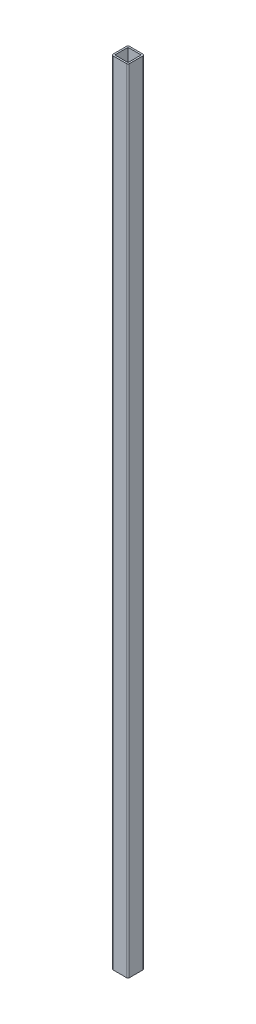
ISO-10303-21;
HEADER;
FILE_DESCRIPTION(('STEP AP214'),'2;1');
FILE_NAME('part.step','',(''),(''),'','','');
FILE_SCHEMA(('AUTOMOTIVE_DESIGN { 1 0 10303 214 1 1 1 1 }'));
ENDSEC;
DATA;
#1=APPLICATION_CONTEXT('core data for automotive mechanical design processes');
#2=APPLICATION_PROTOCOL_DEFINITION('international standard','automotive_design',2000,#1);
#3=PRODUCT_CONTEXT('',#1,'mechanical');
#4=PRODUCT('Part','Part','',(#3));
#5=PRODUCT_RELATED_PRODUCT_CATEGORY('part','',(#4));
#6=PRODUCT_DEFINITION_FORMATION('','',#4);
#7=PRODUCT_DEFINITION_CONTEXT('part definition',#1,'design');
#8=PRODUCT_DEFINITION('design','',#6,#7);
#9=PRODUCT_DEFINITION_SHAPE('','',#8);
#10=(LENGTH_UNIT() NAMED_UNIT(*) SI_UNIT(.MILLI.,.METRE.));
#11=(NAMED_UNIT(*) PLANE_ANGLE_UNIT() SI_UNIT($,.RADIAN.));
#12=(NAMED_UNIT(*) SI_UNIT($,.STERADIAN.) SOLID_ANGLE_UNIT());
#13=UNCERTAINTY_MEASURE_WITH_UNIT(LENGTH_MEASURE(1.E-05),#10,'distance_accuracy_value','');
#14=(GEOMETRIC_REPRESENTATION_CONTEXT(3) GLOBAL_UNCERTAINTY_ASSIGNED_CONTEXT((#13)) GLOBAL_UNIT_ASSIGNED_CONTEXT((#10,
#11,#12)) REPRESENTATION_CONTEXT('',''));
#15=CARTESIAN_POINT('',(0.,0.,0.));
#16=DIRECTION('',(0.,0.,1.));
#17=DIRECTION('',(1.,0.,0.));
#18=AXIS2_PLACEMENT_3D('',#15,#16,#17);
#19=CARTESIAN_POINT('',(12.7,1219.2,-12.7));
#20=DIRECTION('',(0.,0.,1.));
#21=DIRECTION('',(1.,0.,0.));
#22=AXIS2_PLACEMENT_3D('',#19,#20,#21);
#23=PLANE('',#22);
#24=DIRECTION('',(-1.,0.,0.));
#25=VECTOR('',#24,1.);
#26=CARTESIAN_POINT('',(12.7,1219.2,-12.7));
#27=LINE('',#26,#25);
#28=CARTESIAN_POINT('',(10.16,1219.2,-12.7));
#29=VERTEX_POINT('',#28);
#30=CARTESIAN_POINT('',(-10.16,1219.2,-12.7));
#31=VERTEX_POINT('',#30);
#32=EDGE_CURVE('E179',#29,#31,#27,.T.);
#33=ORIENTED_EDGE('',*,*,#32,.F.);
#34=DIRECTION('',(0.,-1.,0.));
#35=VECTOR('',#34,1.);
#36=CARTESIAN_POINT('',(10.16,0.,-12.7));
#37=LINE('',#36,#35);
#38=CARTESIAN_POINT('',(10.16,0.,-12.7));
#39=VERTEX_POINT('',#38);
#40=EDGE_CURVE('E11',#29,#39,#37,.T.);
#41=ORIENTED_EDGE('',*,*,#40,.T.);
#42=DIRECTION('',(-1.,0.,0.));
#43=VECTOR('',#42,1.);
#44=CARTESIAN_POINT('',(12.7,0.,-12.7));
#45=LINE('',#44,#43);
#46=CARTESIAN_POINT('',(-10.16,0.,-12.7));
#47=VERTEX_POINT('',#46);
#48=EDGE_CURVE('E196',#39,#47,#45,.T.);
#49=ORIENTED_EDGE('',*,*,#48,.T.);
#50=DIRECTION('',(0.,-1.,0.));
#51=VECTOR('',#50,1.);
#52=CARTESIAN_POINT('',(-10.16,1219.2,-12.7));
#53=LINE('',#52,#51);
#54=EDGE_CURVE('E48',#47,#31,#53,.F.);
#55=ORIENTED_EDGE('',*,*,#54,.T.);
#56=EDGE_LOOP('',(#33,#41,#49,#55));
#57=FACE_BOUND('',#56,.T.);
#58=ADVANCED_FACE('F39',(#57),#23,.F.);
#59=CARTESIAN_POINT('',(-12.7,1219.2,-12.7));
#60=DIRECTION('',(1.,0.,0.));
#61=DIRECTION('',(0.,0.,-1.));
#62=AXIS2_PLACEMENT_3D('',#59,#60,#61);
#63=PLANE('',#62);
#64=DIRECTION('',(0.,0.,1.));
#65=VECTOR('',#64,1.);
#66=CARTESIAN_POINT('',(-12.7,0.,-12.7));
#67=LINE('',#66,#65);
#68=CARTESIAN_POINT('',(-12.7,0.,-10.16));
#69=VERTEX_POINT('',#68);
#70=CARTESIAN_POINT('',(-12.7,0.,10.16));
#71=VERTEX_POINT('',#70);
#72=EDGE_CURVE('E200',#69,#71,#67,.T.);
#73=ORIENTED_EDGE('',*,*,#72,.T.);
#74=DIRECTION('',(0.,-1.,0.));
#75=VECTOR('',#74,1.);
#76=CARTESIAN_POINT('',(-12.7,1219.2,10.16));
#77=LINE('',#76,#75);
#78=CARTESIAN_POINT('',(-12.7,1219.2,10.16));
#79=VERTEX_POINT('',#78);
#80=EDGE_CURVE('E233',#71,#79,#77,.F.);
#81=ORIENTED_EDGE('',*,*,#80,.T.);
#82=DIRECTION('',(0.,0.,1.));
#83=VECTOR('',#82,1.);
#84=CARTESIAN_POINT('',(-12.7,1219.2,-12.7));
#85=LINE('',#84,#83);
#86=CARTESIAN_POINT('',(-12.7,1219.2,-10.16));
#87=VERTEX_POINT('',#86);
#88=EDGE_CURVE('E183',#87,#79,#85,.T.);
#89=ORIENTED_EDGE('',*,*,#88,.F.);
#90=DIRECTION('',(0.,-1.,0.));
#91=VECTOR('',#90,1.);
#92=CARTESIAN_POINT('',(-12.7,1219.2,-10.16));
#93=LINE('',#92,#91);
#94=EDGE_CURVE('E229',#87,#69,#93,.T.);
#95=ORIENTED_EDGE('',*,*,#94,.T.);
#96=EDGE_LOOP('',(#73,#81,#89,#95));
#97=FACE_BOUND('',#96,.T.);
#98=ADVANCED_FACE('F266',(#97),#63,.F.);
#99=CARTESIAN_POINT('',(12.7,1219.2,12.7));
#100=DIRECTION('',(0.,0.,1.));
#101=DIRECTION('',(1.,0.,0.));
#102=AXIS2_PLACEMENT_3D('',#99,#100,#101);
#103=PLANE('',#102);
#104=DIRECTION('',(-1.,0.,0.));
#105=VECTOR('',#104,1.);
#106=CARTESIAN_POINT('',(12.7,1219.2,12.7));
#107=LINE('',#106,#105);
#108=CARTESIAN_POINT('',(10.16,1219.2,12.7));
#109=VERTEX_POINT('',#108);
#110=CARTESIAN_POINT('',(-10.16,1219.2,12.7));
#111=VERTEX_POINT('',#110);
#112=EDGE_CURVE('E188',#109,#111,#107,.T.);
#113=ORIENTED_EDGE('',*,*,#112,.T.);
#114=DIRECTION('',(0.,-1.,0.));
#115=VECTOR('',#114,1.);
#116=CARTESIAN_POINT('',(-10.16,0.,12.7));
#117=LINE('',#116,#115);
#118=CARTESIAN_POINT('',(-10.16,0.,12.7));
#119=VERTEX_POINT('',#118);
#120=EDGE_CURVE('E213',#111,#119,#117,.T.);
#121=ORIENTED_EDGE('',*,*,#120,.T.);
#122=DIRECTION('',(-1.,0.,0.));
#123=VECTOR('',#122,1.);
#124=CARTESIAN_POINT('',(12.7,0.,12.7));
#125=LINE('',#124,#123);
#126=CARTESIAN_POINT('',(10.16,0.,12.7));
#127=VERTEX_POINT('',#126);
#128=EDGE_CURVE('E204',#127,#119,#125,.T.);
#129=ORIENTED_EDGE('',*,*,#128,.F.);
#130=DIRECTION('',(0.,-1.,0.));
#131=VECTOR('',#130,1.);
#132=CARTESIAN_POINT('',(10.16,1219.2,12.7));
#133=LINE('',#132,#131);
#134=EDGE_CURVE('E195',#127,#109,#133,.F.);
#135=ORIENTED_EDGE('',*,*,#134,.T.);
#136=EDGE_LOOP('',(#113,#121,#129,#135));
#137=FACE_BOUND('',#136,.T.);
#138=ADVANCED_FACE('F274',(#137),#103,.T.);
#139=CARTESIAN_POINT('',(12.7,1219.2,-12.7));
#140=DIRECTION('',(1.,0.,0.));
#141=DIRECTION('',(0.,0.,-1.));
#142=AXIS2_PLACEMENT_3D('',#139,#140,#141);
#143=PLANE('',#142);
#144=DIRECTION('',(0.,0.,1.));
#145=VECTOR('',#144,1.);
#146=CARTESIAN_POINT('',(12.7,1219.2,-12.7));
#147=LINE('',#146,#145);
#148=CARTESIAN_POINT('',(12.7,1219.2,-10.16));
#149=VERTEX_POINT('',#148);
#150=CARTESIAN_POINT('',(12.7,1219.2,10.16));
#151=VERTEX_POINT('',#150);
#152=EDGE_CURVE('E192',#149,#151,#147,.T.);
#153=ORIENTED_EDGE('',*,*,#152,.T.);
#154=DIRECTION('',(0.,-1.,0.));
#155=VECTOR('',#154,1.);
#156=CARTESIAN_POINT('',(12.7,1219.2,10.16));
#157=LINE('',#156,#155);
#158=CARTESIAN_POINT('',(12.7,0.,10.16));
#159=VERTEX_POINT('',#158);
#160=EDGE_CURVE('E249',#151,#159,#157,.T.);
#161=ORIENTED_EDGE('',*,*,#160,.T.);
#162=DIRECTION('',(0.,0.,1.));
#163=VECTOR('',#162,1.);
#164=CARTESIAN_POINT('',(12.7,0.,-12.7));
#165=LINE('',#164,#163);
#166=CARTESIAN_POINT('',(12.7,0.,-10.16));
#167=VERTEX_POINT('',#166);
#168=EDGE_CURVE('E184',#167,#159,#165,.T.);
#169=ORIENTED_EDGE('',*,*,#168,.F.);
#170=DIRECTION('',(0.,-1.,0.));
#171=VECTOR('',#170,1.);
#172=CARTESIAN_POINT('',(12.7,1219.2,-10.16));
#173=LINE('',#172,#171);
#174=EDGE_CURVE('E62',#167,#149,#173,.F.);
#175=ORIENTED_EDGE('',*,*,#174,.T.);
#176=EDGE_LOOP('',(#153,#161,#169,#175));
#177=FACE_BOUND('',#176,.T.);
#178=ADVANCED_FACE('F279',(#177),#143,.T.);
#179=CARTESIAN_POINT('',(0.,1219.2,0.));
#180=DIRECTION('',(0.,1.,0.));
#181=DIRECTION('',(0.,0.,1.));
#182=AXIS2_PLACEMENT_3D('',#179,#180,#181);
#183=PLANE('',#182);
#184=DIRECTION('',(-1.,0.,0.));
#185=VECTOR('',#184,1.);
#186=CARTESIAN_POINT('',(12.7,1219.2,-10.16));
#187=LINE('',#186,#185);
#188=CARTESIAN_POINT('',(10.16,1219.2,-10.16));
#189=VERTEX_POINT('',#188);
#190=CARTESIAN_POINT('',(-10.16,1219.2,-10.16));
#191=VERTEX_POINT('',#190);
#192=EDGE_CURVE('E160',#189,#191,#187,.T.);
#193=ORIENTED_EDGE('',*,*,#192,.F.);
#194=DIRECTION('',(0.,0.,1.));
#195=VECTOR('',#194,1.);
#196=CARTESIAN_POINT('',(10.16,1219.2,-12.7));
#197=LINE('',#196,#195);
#198=CARTESIAN_POINT('',(10.16,1219.2,10.16));
#199=VERTEX_POINT('',#198);
#200=EDGE_CURVE('E139',#189,#199,#197,.T.);
#201=ORIENTED_EDGE('',*,*,#200,.T.);
#202=DIRECTION('',(-1.,0.,0.));
#203=VECTOR('',#202,1.);
#204=CARTESIAN_POINT('',(12.7,1219.2,10.16));
#205=LINE('',#204,#203);
#206=CARTESIAN_POINT('',(-10.16,1219.2,10.16));
#207=VERTEX_POINT('',#206);
#208=EDGE_CURVE('E173',#199,#207,#205,.T.);
#209=ORIENTED_EDGE('',*,*,#208,.T.);
#210=DIRECTION('',(0.,0.,1.));
#211=VECTOR('',#210,1.);
#212=CARTESIAN_POINT('',(-10.16,1219.2,-12.7));
#213=LINE('',#212,#211);
#214=EDGE_CURVE('E164',#191,#207,#213,.T.);
#215=ORIENTED_EDGE('',*,*,#214,.F.);
#216=EDGE_LOOP('',(#193,#201,#209,#215));
#217=FACE_BOUND('',#216,.T.);
#218=ORIENTED_EDGE('',*,*,#88,.T.);
#219=CARTESIAN_POINT('',(-10.16,1219.2,10.16));
#220=DIRECTION('',(0.,1.,0.));
#221=DIRECTION('',(0.,0.,1.));
#222=AXIS2_PLACEMENT_3D('',#219,#220,#221);
#223=CIRCLE('',#222,2.54);
#224=EDGE_CURVE('E244',#79,#111,#223,.T.);
#225=ORIENTED_EDGE('',*,*,#224,.T.);
#226=ORIENTED_EDGE('',*,*,#112,.F.);
#227=CARTESIAN_POINT('',(10.16,1219.2,10.16));
#228=DIRECTION('',(0.,1.,0.));
#229=DIRECTION('',(0.,0.,1.));
#230=AXIS2_PLACEMENT_3D('',#227,#228,#229);
#231=CIRCLE('',#230,2.54);
#232=EDGE_CURVE('E55',#109,#151,#231,.T.);
#233=ORIENTED_EDGE('',*,*,#232,.T.);
#234=ORIENTED_EDGE('',*,*,#152,.F.);
#235=CARTESIAN_POINT('',(10.16,1219.2,-10.16));
#236=DIRECTION('',(0.,1.,0.));
#237=DIRECTION('',(0.,0.,1.));
#238=AXIS2_PLACEMENT_3D('',#235,#236,#237);
#239=CIRCLE('',#238,2.54);
#240=EDGE_CURVE('E239',#149,#29,#239,.T.);
#241=ORIENTED_EDGE('',*,*,#240,.T.);
#242=ORIENTED_EDGE('',*,*,#32,.T.);
#243=CARTESIAN_POINT('',(-10.16,1219.2,-10.16));
#244=DIRECTION('',(0.,1.,0.));
#245=DIRECTION('',(0.,0.,1.));
#246=AXIS2_PLACEMENT_3D('',#243,#244,#245);
#247=CIRCLE('',#246,2.54);
#248=EDGE_CURVE('E236',#31,#87,#247,.T.);
#249=ORIENTED_EDGE('',*,*,#248,.T.);
#250=EDGE_LOOP('',(#218,#225,#226,#233,#234,#241,#242,#249));
#251=FACE_BOUND('',#250,.T.);
#252=ADVANCED_FACE('F260',(#217,#251),#183,.T.);
#253=CARTESIAN_POINT('',(0.,0.,0.));
#254=DIRECTION('',(0.,1.,0.));
#255=DIRECTION('',(0.,0.,1.));
#256=AXIS2_PLACEMENT_3D('',#253,#254,#255);
#257=PLANE('',#256);
#258=DIRECTION('',(0.,0.,1.));
#259=VECTOR('',#258,1.);
#260=CARTESIAN_POINT('',(10.16,0.,-12.7));
#261=LINE('',#260,#259);
#262=CARTESIAN_POINT('',(10.16,0.,-10.16));
#263=VERTEX_POINT('',#262);
#264=CARTESIAN_POINT('',(10.16,0.,10.16));
#265=VERTEX_POINT('',#264);
#266=EDGE_CURVE('E136',#263,#265,#261,.T.);
#267=ORIENTED_EDGE('',*,*,#266,.F.);
#268=DIRECTION('',(-1.,0.,0.));
#269=VECTOR('',#268,1.);
#270=CARTESIAN_POINT('',(12.7,0.,-10.16));
#271=LINE('',#270,#269);
#272=CARTESIAN_POINT('',(-10.16,0.,-10.16));
#273=VERTEX_POINT('',#272);
#274=EDGE_CURVE('E147',#263,#273,#271,.T.);
#275=ORIENTED_EDGE('',*,*,#274,.T.);
#276=DIRECTION('',(0.,0.,1.));
#277=VECTOR('',#276,1.);
#278=CARTESIAN_POINT('',(-10.16,0.,-12.7));
#279=LINE('',#278,#277);
#280=CARTESIAN_POINT('',(-10.16,0.,10.16));
#281=VERTEX_POINT('',#280);
#282=EDGE_CURVE('E154',#273,#281,#279,.T.);
#283=ORIENTED_EDGE('',*,*,#282,.T.);
#284=DIRECTION('',(-1.,0.,0.));
#285=VECTOR('',#284,1.);
#286=CARTESIAN_POINT('',(12.7,0.,10.16));
#287=LINE('',#286,#285);
#288=EDGE_CURVE('E158',#265,#281,#287,.T.);
#289=ORIENTED_EDGE('',*,*,#288,.F.);
#290=EDGE_LOOP('',(#267,#275,#283,#289));
#291=FACE_BOUND('',#290,.T.);
#292=ORIENTED_EDGE('',*,*,#128,.T.);
#293=CARTESIAN_POINT('',(-10.16,0.,10.16));
#294=DIRECTION('',(0.,1.,0.));
#295=DIRECTION('',(0.,0.,1.));
#296=AXIS2_PLACEMENT_3D('',#293,#294,#295);
#297=CIRCLE('',#296,2.54);
#298=EDGE_CURVE('E226',#119,#71,#297,.F.);
#299=ORIENTED_EDGE('',*,*,#298,.T.);
#300=ORIENTED_EDGE('',*,*,#72,.F.);
#301=CARTESIAN_POINT('',(-10.16,0.,-10.16));
#302=DIRECTION('',(0.,1.,0.));
#303=DIRECTION('',(0.,0.,1.));
#304=AXIS2_PLACEMENT_3D('',#301,#302,#303);
#305=CIRCLE('',#304,2.54);
#306=EDGE_CURVE('E217',#69,#47,#305,.F.);
#307=ORIENTED_EDGE('',*,*,#306,.T.);
#308=ORIENTED_EDGE('',*,*,#48,.F.);
#309=CARTESIAN_POINT('',(10.16,0.,-10.16));
#310=DIRECTION('',(0.,1.,0.));
#311=DIRECTION('',(0.,0.,1.));
#312=AXIS2_PLACEMENT_3D('',#309,#310,#311);
#313=CIRCLE('',#312,2.54);
#314=EDGE_CURVE('E220',#39,#167,#313,.F.);
#315=ORIENTED_EDGE('',*,*,#314,.T.);
#316=ORIENTED_EDGE('',*,*,#168,.T.);
#317=CARTESIAN_POINT('',(10.16,0.,10.16));
#318=DIRECTION('',(0.,1.,0.));
#319=DIRECTION('',(0.,0.,1.));
#320=AXIS2_PLACEMENT_3D('',#317,#318,#319);
#321=CIRCLE('',#320,2.54);
#322=EDGE_CURVE('E223',#159,#127,#321,.F.);
#323=ORIENTED_EDGE('',*,*,#322,.T.);
#324=EDGE_LOOP('',(#292,#299,#300,#307,#308,#315,#316,#323));
#325=FACE_BOUND('',#324,.T.);
#326=ADVANCED_FACE('F156',(#291,#325),#257,.F.);
#327=CARTESIAN_POINT('',(12.7,1219.2,-10.16));
#328=DIRECTION('',(0.,0.,1.));
#329=DIRECTION('',(1.,0.,0.));
#330=AXIS2_PLACEMENT_3D('',#327,#328,#329);
#331=PLANE('',#330);
#332=ORIENTED_EDGE('',*,*,#274,.F.);
#333=DIRECTION('',(0.,-1.,0.));
#334=VECTOR('',#333,1.);
#335=CARTESIAN_POINT('',(10.16,1219.2,-10.16));
#336=LINE('',#335,#334);
#337=EDGE_CURVE('E131',#189,#263,#336,.T.);
#338=ORIENTED_EDGE('',*,*,#337,.F.);
#339=ORIENTED_EDGE('',*,*,#192,.T.);
#340=DIRECTION('',(0.,-1.,0.));
#341=VECTOR('',#340,1.);
#342=CARTESIAN_POINT('',(-10.16,1219.2,-10.16));
#343=LINE('',#342,#341);
#344=EDGE_CURVE('E150',#191,#273,#343,.T.);
#345=ORIENTED_EDGE('',*,*,#344,.T.);
#346=EDGE_LOOP('',(#332,#338,#339,#345));
#347=FACE_BOUND('',#346,.T.);
#348=ADVANCED_FACE('F148',(#347),#331,.T.);
#349=CARTESIAN_POINT('',(-10.16,1219.2,-12.7));
#350=DIRECTION('',(1.,0.,0.));
#351=DIRECTION('',(0.,0.,-1.));
#352=AXIS2_PLACEMENT_3D('',#349,#350,#351);
#353=PLANE('',#352);
#354=ORIENTED_EDGE('',*,*,#282,.F.);
#355=ORIENTED_EDGE('',*,*,#344,.F.);
#356=ORIENTED_EDGE('',*,*,#214,.T.);
#357=DIRECTION('',(0.,-1.,0.));
#358=VECTOR('',#357,1.);
#359=CARTESIAN_POINT('',(-10.16,1219.2,10.16));
#360=LINE('',#359,#358);
#361=EDGE_CURVE('E400',#207,#281,#360,.T.);
#362=ORIENTED_EDGE('',*,*,#361,.T.);
#363=EDGE_LOOP('',(#354,#355,#356,#362));
#364=FACE_BOUND('',#363,.T.);
#365=ADVANCED_FACE('F305',(#364),#353,.T.);
#366=CARTESIAN_POINT('',(12.7,1219.2,10.16));
#367=DIRECTION('',(0.,0.,1.));
#368=DIRECTION('',(1.,0.,0.));
#369=AXIS2_PLACEMENT_3D('',#366,#367,#368);
#370=PLANE('',#369);
#371=ORIENTED_EDGE('',*,*,#288,.T.);
#372=ORIENTED_EDGE('',*,*,#361,.F.);
#373=ORIENTED_EDGE('',*,*,#208,.F.);
#374=DIRECTION('',(0.,-1.,0.));
#375=VECTOR('',#374,1.);
#376=CARTESIAN_POINT('',(10.16,1219.2,10.16));
#377=LINE('',#376,#375);
#378=EDGE_CURVE('E143',#199,#265,#377,.T.);
#379=ORIENTED_EDGE('',*,*,#378,.T.);
#380=EDGE_LOOP('',(#371,#372,#373,#379));
#381=FACE_BOUND('',#380,.T.);
#382=ADVANCED_FACE('F300',(#381),#370,.F.);
#383=CARTESIAN_POINT('',(10.16,1219.2,-12.7));
#384=DIRECTION('',(1.,0.,0.));
#385=DIRECTION('',(0.,0.,-1.));
#386=AXIS2_PLACEMENT_3D('',#383,#384,#385);
#387=PLANE('',#386);
#388=ORIENTED_EDGE('',*,*,#266,.T.);
#389=ORIENTED_EDGE('',*,*,#378,.F.);
#390=ORIENTED_EDGE('',*,*,#200,.F.);
#391=ORIENTED_EDGE('',*,*,#337,.T.);
#392=EDGE_LOOP('',(#388,#389,#390,#391));
#393=FACE_BOUND('',#392,.T.);
#394=ADVANCED_FACE('F133',(#393),#387,.F.);
#395=CARTESIAN_POINT('',(-10.16,1219.2,10.16));
#396=DIRECTION('',(0.,1.,0.));
#397=DIRECTION('',(0.,0.,1.));
#398=AXIS2_PLACEMENT_3D('',#395,#396,#397);
#399=CYLINDRICAL_SURFACE('',#398,2.54);
#400=ORIENTED_EDGE('',*,*,#224,.F.);
#401=ORIENTED_EDGE('',*,*,#80,.F.);
#402=ORIENTED_EDGE('',*,*,#298,.F.);
#403=ORIENTED_EDGE('',*,*,#120,.F.);
#404=EDGE_LOOP('',(#400,#401,#402,#403));
#405=FACE_BOUND('',#404,.T.);
#406=ADVANCED_FACE('F272',(#405),#399,.T.);
#407=CARTESIAN_POINT('',(10.16,1219.2,10.16));
#408=DIRECTION('',(0.,-1.,0.));
#409=DIRECTION('',(0.,0.,-1.));
#410=AXIS2_PLACEMENT_3D('',#407,#408,#409);
#411=CYLINDRICAL_SURFACE('',#410,2.54);
#412=ORIENTED_EDGE('',*,*,#232,.F.);
#413=ORIENTED_EDGE('',*,*,#134,.F.);
#414=ORIENTED_EDGE('',*,*,#322,.F.);
#415=ORIENTED_EDGE('',*,*,#160,.F.);
#416=EDGE_LOOP('',(#412,#413,#414,#415));
#417=FACE_BOUND('',#416,.T.);
#418=ADVANCED_FACE('F278',(#417),#411,.T.);
#419=CARTESIAN_POINT('',(10.16,1219.2,-10.16));
#420=DIRECTION('',(0.,1.,0.));
#421=DIRECTION('',(0.,0.,1.));
#422=AXIS2_PLACEMENT_3D('',#419,#420,#421);
#423=CYLINDRICAL_SURFACE('',#422,2.54);
#424=ORIENTED_EDGE('',*,*,#240,.F.);
#425=ORIENTED_EDGE('',*,*,#174,.F.);
#426=ORIENTED_EDGE('',*,*,#314,.F.);
#427=ORIENTED_EDGE('',*,*,#40,.F.);
#428=EDGE_LOOP('',(#424,#425,#426,#427));
#429=FACE_BOUND('',#428,.T.);
#430=ADVANCED_FACE('F281',(#429),#423,.T.);
#431=CARTESIAN_POINT('',(-10.16,1219.2,-10.16));
#432=DIRECTION('',(0.,-1.,0.));
#433=DIRECTION('',(0.,0.,-1.));
#434=AXIS2_PLACEMENT_3D('',#431,#432,#433);
#435=CYLINDRICAL_SURFACE('',#434,2.54);
#436=ORIENTED_EDGE('',*,*,#248,.F.);
#437=ORIENTED_EDGE('',*,*,#54,.F.);
#438=ORIENTED_EDGE('',*,*,#306,.F.);
#439=ORIENTED_EDGE('',*,*,#94,.F.);
#440=EDGE_LOOP('',(#436,#437,#438,#439));
#441=FACE_BOUND('',#440,.T.);
#442=ADVANCED_FACE('F41',(#441),#435,.T.);
#443=CLOSED_SHELL('',(#58,#98,#138,#178,#252,#326,#348,#365,#382,#394,#406,#418,#430,#442));
#444=MANIFOLD_SOLID_BREP('B2',#443);
#445=ADVANCED_BREP_SHAPE_REPRESENTATION('',(#18,#444),#14);
#446=SHAPE_DEFINITION_REPRESENTATION(#9,#445);
ENDSEC;
END-ISO-10303-21;
